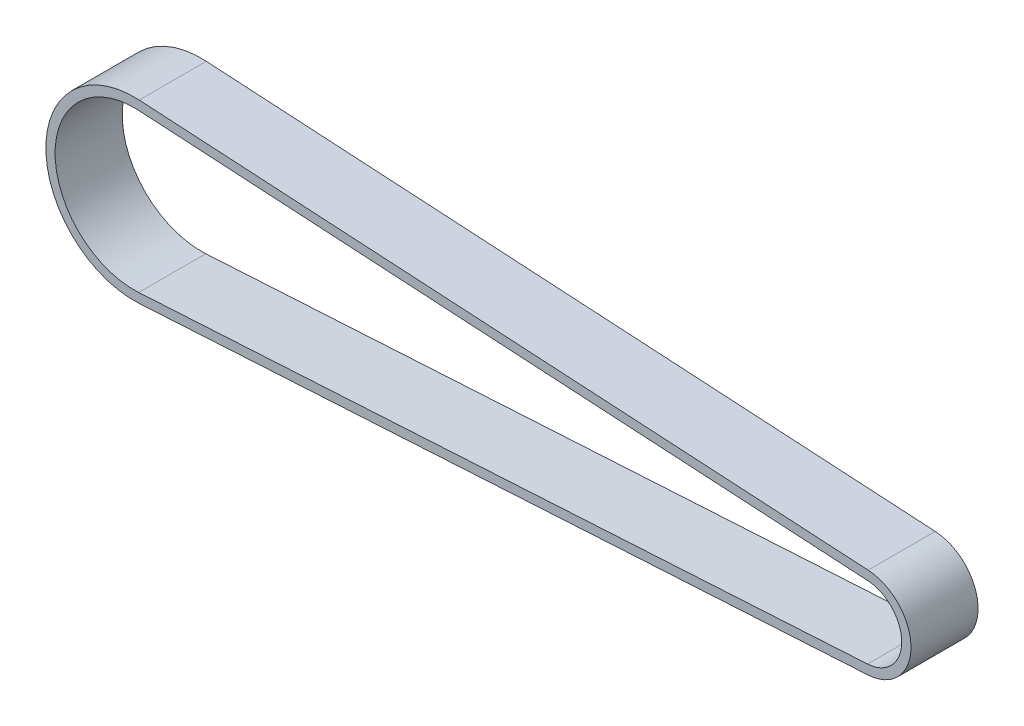
ISO-10303-21;
HEADER;
FILE_DESCRIPTION(('STEP AP214'),'2;1');
FILE_NAME('part.step','',(''),(''),'','','');
FILE_SCHEMA(('AUTOMOTIVE_DESIGN { 1 0 10303 214 1 1 1 1 }'));
ENDSEC;
DATA;
#1=APPLICATION_CONTEXT('core data for automotive mechanical design processes');
#2=APPLICATION_PROTOCOL_DEFINITION('international standard','automotive_design',2000,#1);
#3=PRODUCT_CONTEXT('',#1,'mechanical');
#4=PRODUCT('Part','Part','',(#3));
#5=PRODUCT_RELATED_PRODUCT_CATEGORY('part','',(#4));
#6=PRODUCT_DEFINITION_FORMATION('','',#4);
#7=PRODUCT_DEFINITION_CONTEXT('part definition',#1,'design');
#8=PRODUCT_DEFINITION('design','',#6,#7);
#9=PRODUCT_DEFINITION_SHAPE('','',#8);
#10=(LENGTH_UNIT() NAMED_UNIT(*) SI_UNIT(.MILLI.,.METRE.));
#11=(NAMED_UNIT(*) PLANE_ANGLE_UNIT() SI_UNIT($,.RADIAN.));
#12=(NAMED_UNIT(*) SI_UNIT($,.STERADIAN.) SOLID_ANGLE_UNIT());
#13=UNCERTAINTY_MEASURE_WITH_UNIT(LENGTH_MEASURE(1.E-05),#10,'distance_accuracy_value','');
#14=(GEOMETRIC_REPRESENTATION_CONTEXT(3) GLOBAL_UNCERTAINTY_ASSIGNED_CONTEXT((#13)) GLOBAL_UNIT_ASSIGNED_CONTEXT((#10,
#11,#12)) REPRESENTATION_CONTEXT('',''));
#15=CARTESIAN_POINT('',(0.,0.,0.));
#16=DIRECTION('',(0.,0.,1.));
#17=DIRECTION('',(1.,0.,0.));
#18=AXIS2_PLACEMENT_3D('',#15,#16,#17);
#19=CARTESIAN_POINT('',(109.,0.,-10.));
#20=DIRECTION('',(0.,0.,1.));
#21=DIRECTION('',(1.,0.,0.));
#22=AXIS2_PLACEMENT_3D('',#19,#20,#21);
#23=CYLINDRICAL_SURFACE('',#22,6.7830025);
#24=CARTESIAN_POINT('',(109.,0.,0.));
#25=DIRECTION('',(0.,0.,1.));
#26=DIRECTION('',(1.,0.,0.));
#27=AXIS2_PLACEMENT_3D('',#24,#25,#26);
#28=CIRCLE('',#27,6.7830025);
#29=CARTESIAN_POINT('',(109.396164528055,-6.77142352697845,0.));
#30=VERTEX_POINT('',#29);
#31=CARTESIAN_POINT('',(109.396164528055,6.77142352697845,0.));
#32=VERTEX_POINT('',#31);
#33=EDGE_CURVE('E131',#30,#32,#28,.T.);
#34=ORIENTED_EDGE('',*,*,#33,.F.);
#35=DIRECTION('',(0.,0.,1.));
#36=VECTOR('',#35,1.);
#37=CARTESIAN_POINT('',(109.396164528055,-6.77142352697845,-10.));
#38=LINE('',#37,#36);
#39=CARTESIAN_POINT('',(109.396164528055,-6.77142352697845,-10.));
#40=VERTEX_POINT('',#39);
#41=EDGE_CURVE('E11',#40,#30,#38,.T.);
#42=ORIENTED_EDGE('',*,*,#41,.F.);
#43=CARTESIAN_POINT('',(109.,0.,-10.));
#44=DIRECTION('',(0.,0.,1.));
#45=DIRECTION('',(1.,0.,0.));
#46=AXIS2_PLACEMENT_3D('',#43,#44,#45);
#47=CIRCLE('',#46,6.7830025);
#48=CARTESIAN_POINT('',(109.396164528055,6.77142352697845,-10.));
#49=VERTEX_POINT('',#48);
#50=EDGE_CURVE('E135',#40,#49,#47,.T.);
#51=ORIENTED_EDGE('',*,*,#50,.T.);
#52=DIRECTION('',(0.,0.,1.));
#53=VECTOR('',#52,1.);
#54=CARTESIAN_POINT('',(109.396164528055,6.77142352697845,-10.));
#55=LINE('',#54,#53);
#56=EDGE_CURVE('E36',#49,#32,#55,.T.);
#57=ORIENTED_EDGE('',*,*,#56,.T.);
#58=EDGE_LOOP('',(#34,#42,#51,#57));
#59=FACE_BOUND('',#58,.T.);
#60=ADVANCED_FACE('F33',(#59),#23,.T.);
#61=CARTESIAN_POINT('',(109.396164528055,-6.77142352697845,-10.));
#62=DIRECTION('',(0.0584054816513761,-0.998292942834452,0.));
#63=DIRECTION('',(0.998292942834452,0.0584054816513761,0.));
#64=AXIS2_PLACEMENT_3D('',#61,#62,#63);
#65=PLANE('',#64);
#66=DIRECTION('',(0.998292942834452,0.0584054816513761,0.));
#67=VECTOR('',#66,1.);
#68=CARTESIAN_POINT('',(109.396164528055,-6.77142352697845,0.));
#69=LINE('',#68,#67);
#70=CARTESIAN_POINT('',(0.767985359330274,-13.1267535639188,0.));
#71=VERTEX_POINT('',#70);
#72=EDGE_CURVE('E139',#71,#30,#69,.T.);
#73=ORIENTED_EDGE('',*,*,#72,.F.);
#74=DIRECTION('',(0.,0.,1.));
#75=VECTOR('',#74,1.);
#76=CARTESIAN_POINT('',(0.767985359330274,-13.1267535639188,-10.));
#77=LINE('',#76,#75);
#78=CARTESIAN_POINT('',(0.767985359330274,-13.1267535639188,-10.));
#79=VERTEX_POINT('',#78);
#80=EDGE_CURVE('E41',#79,#71,#77,.T.);
#81=ORIENTED_EDGE('',*,*,#80,.F.);
#82=DIRECTION('',(0.998292942834452,0.0584054816513761,0.));
#83=VECTOR('',#82,1.);
#84=CARTESIAN_POINT('',(109.396164528055,-6.77142352697845,-10.));
#85=LINE('',#84,#83);
#86=EDGE_CURVE('E145',#79,#40,#85,.T.);
#87=ORIENTED_EDGE('',*,*,#86,.T.);
#88=ORIENTED_EDGE('',*,*,#41,.T.);
#89=EDGE_LOOP('',(#73,#81,#87,#88));
#90=FACE_BOUND('',#89,.T.);
#91=ADVANCED_FACE('F171',(#90),#65,.T.);
#92=CARTESIAN_POINT('',(0.,0.,-10.));
#93=DIRECTION('',(0.,0.,1.));
#94=DIRECTION('',(1.,0.,0.));
#95=AXIS2_PLACEMENT_3D('',#92,#93,#94);
#96=CYLINDRICAL_SURFACE('',#95,13.1492);
#97=CARTESIAN_POINT('',(0.,0.,0.));
#98=DIRECTION('',(0.,0.,1.));
#99=DIRECTION('',(1.,0.,0.));
#100=AXIS2_PLACEMENT_3D('',#97,#98,#99);
#101=CIRCLE('',#100,13.1492);
#102=CARTESIAN_POINT('',(0.767985359330274,13.1267535639188,0.));
#103=VERTEX_POINT('',#102);
#104=EDGE_CURVE('E153',#103,#71,#101,.T.);
#105=ORIENTED_EDGE('',*,*,#104,.F.);
#106=DIRECTION('',(0.,0.,1.));
#107=VECTOR('',#106,1.);
#108=CARTESIAN_POINT('',(0.767985359330274,13.1267535639188,-10.));
#109=LINE('',#108,#107);
#110=CARTESIAN_POINT('',(0.767985359330274,13.1267535639188,-10.));
#111=VERTEX_POINT('',#110);
#112=EDGE_CURVE('E158',#111,#103,#109,.T.);
#113=ORIENTED_EDGE('',*,*,#112,.F.);
#114=CARTESIAN_POINT('',(0.,0.,-10.));
#115=DIRECTION('',(0.,0.,1.));
#116=DIRECTION('',(1.,0.,0.));
#117=AXIS2_PLACEMENT_3D('',#114,#115,#116);
#118=CIRCLE('',#117,13.1492);
#119=EDGE_CURVE('E142',#111,#79,#118,.T.);
#120=ORIENTED_EDGE('',*,*,#119,.T.);
#121=ORIENTED_EDGE('',*,*,#80,.T.);
#122=EDGE_LOOP('',(#105,#113,#120,#121));
#123=FACE_BOUND('',#122,.T.);
#124=ADVANCED_FACE('F175',(#123),#96,.T.);
#125=CARTESIAN_POINT('',(0.767985359330275,13.1267535639188,-10.));
#126=DIRECTION('',(0.0584054816513761,0.998292942834452,0.));
#127=DIRECTION('',(-0.998292942834452,0.0584054816513761,0.));
#128=AXIS2_PLACEMENT_3D('',#125,#126,#127);
#129=PLANE('',#128);
#130=DIRECTION('',(-0.998292942834452,0.0584054816513761,0.));
#131=VECTOR('',#130,1.);
#132=CARTESIAN_POINT('',(0.767985359330275,13.1267535639188,0.));
#133=LINE('',#132,#131);
#134=EDGE_CURVE('E150',#32,#103,#133,.T.);
#135=ORIENTED_EDGE('',*,*,#134,.F.);
#136=ORIENTED_EDGE('',*,*,#56,.F.);
#137=DIRECTION('',(-0.998292942834452,0.0584054816513761,0.));
#138=VECTOR('',#137,1.);
#139=CARTESIAN_POINT('',(0.767985359330275,13.1267535639188,-10.));
#140=LINE('',#139,#138);
#141=EDGE_CURVE('E138',#49,#111,#140,.T.);
#142=ORIENTED_EDGE('',*,*,#141,.T.);
#143=ORIENTED_EDGE('',*,*,#112,.T.);
#144=EDGE_LOOP('',(#135,#136,#142,#143));
#145=FACE_BOUND('',#144,.T.);
#146=ADVANCED_FACE('F166',(#145),#129,.T.);
#147=CARTESIAN_POINT('',(109.,0.,-10.));
#148=DIRECTION('',(0.,0.,1.));
#149=DIRECTION('',(1.,0.,0.));
#150=AXIS2_PLACEMENT_3D('',#147,#148,#149);
#151=PLANE('',#150);
#152=DIRECTION('',(-0.998292942834452,0.0584054816513761,0.));
#153=VECTOR('',#152,1.);
#154=CARTESIAN_POINT('',(0.687385794651376,11.7491093028072,-10.));
#155=LINE('',#154,#153);
#156=CARTESIAN_POINT('',(109.315564963376,5.3937792658669,-10.));
#157=VERTEX_POINT('',#156);
#158=CARTESIAN_POINT('',(0.687385794651376,11.7491093028072,-10.));
#159=VERTEX_POINT('',#158);
#160=EDGE_CURVE('E106',#157,#159,#155,.T.);
#161=ORIENTED_EDGE('',*,*,#160,.T.);
#162=CARTESIAN_POINT('',(0.,0.,-10.));
#163=DIRECTION('',(0.,0.,1.));
#164=DIRECTION('',(1.,0.,0.));
#165=AXIS2_PLACEMENT_3D('',#162,#163,#164);
#166=CIRCLE('',#165,11.7692);
#167=CARTESIAN_POINT('',(0.687385794651378,-11.7491093028072,-10.));
#168=VERTEX_POINT('',#167);
#169=EDGE_CURVE('E100',#159,#168,#166,.T.);
#170=ORIENTED_EDGE('',*,*,#169,.T.);
#171=DIRECTION('',(0.998292942834452,0.0584054816513762,0.));
#172=VECTOR('',#171,1.);
#173=CARTESIAN_POINT('',(109.315564963376,-5.3937792658669,-10.));
#174=LINE('',#173,#172);
#175=CARTESIAN_POINT('',(109.315564963376,-5.3937792658669,-10.));
#176=VERTEX_POINT('',#175);
#177=EDGE_CURVE('E109',#168,#176,#174,.T.);
#178=ORIENTED_EDGE('',*,*,#177,.T.);
#179=CARTESIAN_POINT('',(109.,0.,-10.));
#180=DIRECTION('',(0.,0.,1.));
#181=DIRECTION('',(1.,0.,0.));
#182=AXIS2_PLACEMENT_3D('',#179,#180,#181);
#183=CIRCLE('',#182,5.4030025);
#184=EDGE_CURVE('E49',#176,#157,#183,.T.);
#185=ORIENTED_EDGE('',*,*,#184,.T.);
#186=EDGE_LOOP('',(#161,#170,#178,#185));
#187=FACE_BOUND('',#186,.T.);
#188=ORIENTED_EDGE('',*,*,#50,.F.);
#189=ORIENTED_EDGE('',*,*,#86,.F.);
#190=ORIENTED_EDGE('',*,*,#119,.F.);
#191=ORIENTED_EDGE('',*,*,#141,.F.);
#192=EDGE_LOOP('',(#188,#189,#190,#191));
#193=FACE_BOUND('',#192,.T.);
#194=ADVANCED_FACE('F113',(#187,#193),#151,.F.);
#195=CARTESIAN_POINT('',(109.,0.,0.));
#196=DIRECTION('',(0.,0.,1.));
#197=DIRECTION('',(1.,0.,0.));
#198=AXIS2_PLACEMENT_3D('',#195,#196,#197);
#199=PLANE('',#198);
#200=CARTESIAN_POINT('',(0.,0.,0.));
#201=DIRECTION('',(0.,0.,1.));
#202=DIRECTION('',(1.,0.,0.));
#203=AXIS2_PLACEMENT_3D('',#200,#201,#202);
#204=CIRCLE('',#203,11.7692);
#205=CARTESIAN_POINT('',(0.687385794651376,11.7491093028072,0.));
#206=VERTEX_POINT('',#205);
#207=CARTESIAN_POINT('',(0.687385794651371,-11.7491093028072,0.));
#208=VERTEX_POINT('',#207);
#209=EDGE_CURVE('E57',#206,#208,#204,.T.);
#210=ORIENTED_EDGE('',*,*,#209,.F.);
#211=DIRECTION('',(-0.998292942834452,0.0584054816513761,0.));
#212=VECTOR('',#211,1.);
#213=CARTESIAN_POINT('',(0.687385794651376,11.7491093028072,0.));
#214=LINE('',#213,#212);
#215=CARTESIAN_POINT('',(109.315564963376,5.3937792658669,0.));
#216=VERTEX_POINT('',#215);
#217=EDGE_CURVE('E116',#216,#206,#214,.T.);
#218=ORIENTED_EDGE('',*,*,#217,.F.);
#219=CARTESIAN_POINT('',(109.,0.,0.));
#220=DIRECTION('',(0.,0.,1.));
#221=DIRECTION('',(1.,0.,0.));
#222=AXIS2_PLACEMENT_3D('',#219,#220,#221);
#223=CIRCLE('',#222,5.4030025);
#224=CARTESIAN_POINT('',(109.315564963376,-5.3937792658669,0.));
#225=VERTEX_POINT('',#224);
#226=EDGE_CURVE('E119',#225,#216,#223,.T.);
#227=ORIENTED_EDGE('',*,*,#226,.F.);
#228=DIRECTION('',(0.998292942834452,0.0584054816513762,0.));
#229=VECTOR('',#228,1.);
#230=CARTESIAN_POINT('',(109.315564963376,-5.3937792658669,0.));
#231=LINE('',#230,#229);
#232=EDGE_CURVE('E125',#208,#225,#231,.T.);
#233=ORIENTED_EDGE('',*,*,#232,.F.);
#234=EDGE_LOOP('',(#210,#218,#227,#233));
#235=FACE_BOUND('',#234,.T.);
#236=ORIENTED_EDGE('',*,*,#33,.T.);
#237=ORIENTED_EDGE('',*,*,#134,.T.);
#238=ORIENTED_EDGE('',*,*,#104,.T.);
#239=ORIENTED_EDGE('',*,*,#72,.T.);
#240=EDGE_LOOP('',(#236,#237,#238,#239));
#241=FACE_BOUND('',#240,.T.);
#242=ADVANCED_FACE('F168',(#235,#241),#199,.T.);
#243=CARTESIAN_POINT('',(0.,0.,-10.));
#244=DIRECTION('',(0.,0.,1.));
#245=DIRECTION('',(1.,0.,0.));
#246=AXIS2_PLACEMENT_3D('',#243,#244,#245);
#247=CYLINDRICAL_SURFACE('',#246,11.7692);
#248=ORIENTED_EDGE('',*,*,#209,.T.);
#249=DIRECTION('',(0.,0.,1.));
#250=VECTOR('',#249,1.);
#251=CARTESIAN_POINT('',(0.687385794651378,-11.7491093028072,-10.));
#252=LINE('',#251,#250);
#253=EDGE_CURVE('E96',#168,#208,#252,.T.);
#254=ORIENTED_EDGE('',*,*,#253,.F.);
#255=ORIENTED_EDGE('',*,*,#169,.F.);
#256=DIRECTION('',(0.,0.,1.));
#257=VECTOR('',#256,1.);
#258=CARTESIAN_POINT('',(0.687385794651376,11.7491093028072,-10.));
#259=LINE('',#258,#257);
#260=EDGE_CURVE('E129',#159,#206,#259,.T.);
#261=ORIENTED_EDGE('',*,*,#260,.T.);
#262=EDGE_LOOP('',(#248,#254,#255,#261));
#263=FACE_BOUND('',#262,.T.);
#264=ADVANCED_FACE('F98',(#263),#247,.F.);
#265=CARTESIAN_POINT('',(0.687385794651376,11.7491093028072,-10.));
#266=DIRECTION('',(0.0584054816513761,0.998292942834452,0.));
#267=DIRECTION('',(-0.998292942834452,0.0584054816513762,0.));
#268=AXIS2_PLACEMENT_3D('',#265,#266,#267);
#269=PLANE('',#268);
#270=ORIENTED_EDGE('',*,*,#217,.T.);
#271=ORIENTED_EDGE('',*,*,#260,.F.);
#272=ORIENTED_EDGE('',*,*,#160,.F.);
#273=DIRECTION('',(0.,0.,1.));
#274=VECTOR('',#273,1.);
#275=CARTESIAN_POINT('',(109.315564963376,5.3937792658669,-10.));
#276=LINE('',#275,#274);
#277=EDGE_CURVE('E132',#157,#216,#276,.T.);
#278=ORIENTED_EDGE('',*,*,#277,.T.);
#279=EDGE_LOOP('',(#270,#271,#272,#278));
#280=FACE_BOUND('',#279,.T.);
#281=ADVANCED_FACE('F226',(#280),#269,.F.);
#282=CARTESIAN_POINT('',(109.,0.,-10.));
#283=DIRECTION('',(0.,0.,1.));
#284=DIRECTION('',(1.,0.,0.));
#285=AXIS2_PLACEMENT_3D('',#282,#283,#284);
#286=CYLINDRICAL_SURFACE('',#285,5.4030025);
#287=ORIENTED_EDGE('',*,*,#226,.T.);
#288=ORIENTED_EDGE('',*,*,#277,.F.);
#289=ORIENTED_EDGE('',*,*,#184,.F.);
#290=DIRECTION('',(0.,0.,1.));
#291=VECTOR('',#290,1.);
#292=CARTESIAN_POINT('',(109.315564963376,-5.3937792658669,-10.));
#293=LINE('',#292,#291);
#294=EDGE_CURVE('E105',#176,#225,#293,.T.);
#295=ORIENTED_EDGE('',*,*,#294,.T.);
#296=EDGE_LOOP('',(#287,#288,#289,#295));
#297=FACE_BOUND('',#296,.T.);
#298=ADVANCED_FACE('F235',(#297),#286,.F.);
#299=CARTESIAN_POINT('',(109.315564963376,-5.3937792658669,-10.));
#300=DIRECTION('',(0.0584054816513761,-0.998292942834452,0.));
#301=DIRECTION('',(0.998292942834452,0.0584054816513762,0.));
#302=AXIS2_PLACEMENT_3D('',#299,#300,#301);
#303=PLANE('',#302);
#304=ORIENTED_EDGE('',*,*,#232,.T.);
#305=ORIENTED_EDGE('',*,*,#294,.F.);
#306=ORIENTED_EDGE('',*,*,#177,.F.);
#307=ORIENTED_EDGE('',*,*,#253,.T.);
#308=EDGE_LOOP('',(#304,#305,#306,#307));
#309=FACE_BOUND('',#308,.T.);
#310=ADVANCED_FACE('F110',(#309),#303,.F.);
#311=CLOSED_SHELL('',(#60,#91,#124,#146,#194,#242,#264,#281,#298,#310));
#312=MANIFOLD_SOLID_BREP('B2',#311);
#313=ADVANCED_BREP_SHAPE_REPRESENTATION('',(#18,#312),#14);
#314=SHAPE_DEFINITION_REPRESENTATION(#9,#313);
ENDSEC;
END-ISO-10303-21;
